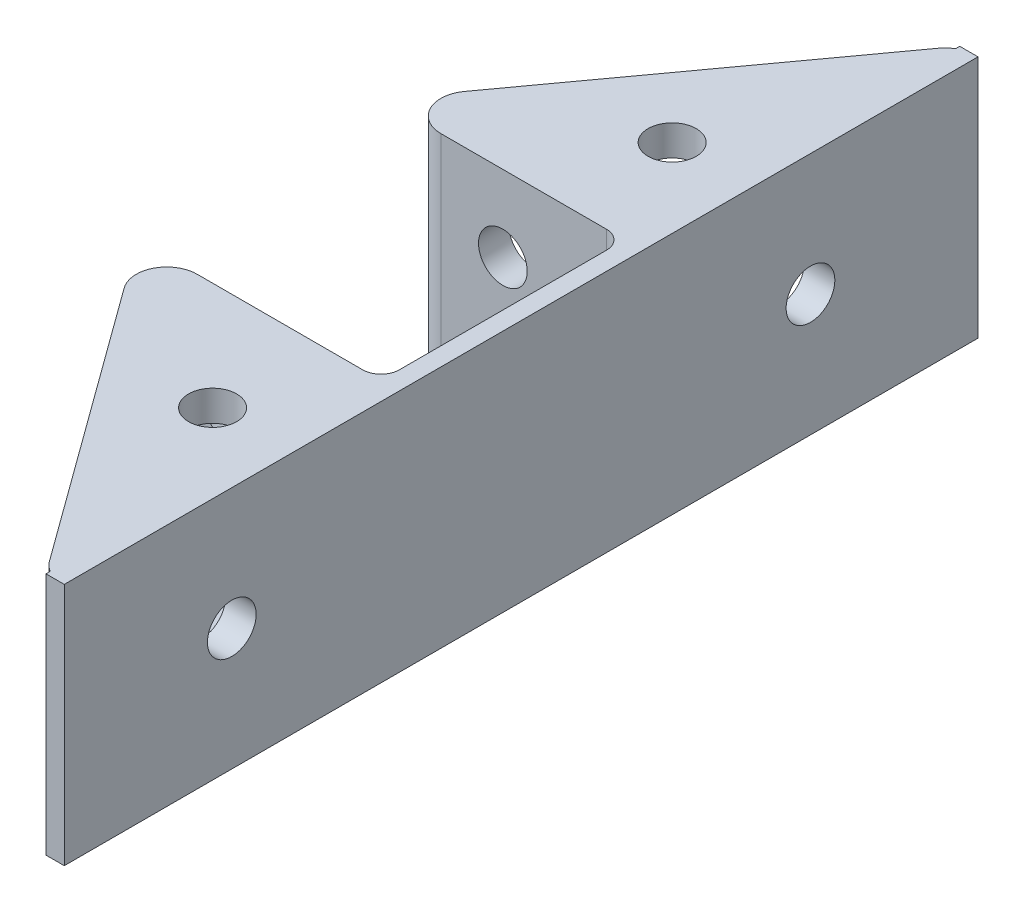
ISO-10303-21;
HEADER;
FILE_DESCRIPTION(('STEP AP214'),'2;1');
FILE_NAME('part.step','',(''),(''),'','','');
FILE_SCHEMA(('AUTOMOTIVE_DESIGN { 1 0 10303 214 1 1 1 1 }'));
ENDSEC;
DATA;
#1=APPLICATION_CONTEXT('core data for automotive mechanical design processes');
#2=APPLICATION_PROTOCOL_DEFINITION('international standard','automotive_design',2000,#1);
#3=PRODUCT_CONTEXT('',#1,'mechanical');
#4=PRODUCT('Part','Part','',(#3));
#5=PRODUCT_RELATED_PRODUCT_CATEGORY('part','',(#4));
#6=PRODUCT_DEFINITION_FORMATION('','',#4);
#7=PRODUCT_DEFINITION_CONTEXT('part definition',#1,'design');
#8=PRODUCT_DEFINITION('design','',#6,#7);
#9=PRODUCT_DEFINITION_SHAPE('','',#8);
#10=(LENGTH_UNIT() NAMED_UNIT(*) SI_UNIT(.MILLI.,.METRE.));
#11=(NAMED_UNIT(*) PLANE_ANGLE_UNIT() SI_UNIT($,.RADIAN.));
#12=(NAMED_UNIT(*) SI_UNIT($,.STERADIAN.) SOLID_ANGLE_UNIT());
#13=UNCERTAINTY_MEASURE_WITH_UNIT(LENGTH_MEASURE(1.E-05),#10,'distance_accuracy_value','');
#14=(GEOMETRIC_REPRESENTATION_CONTEXT(3) GLOBAL_UNCERTAINTY_ASSIGNED_CONTEXT((#13)) GLOBAL_UNIT_ASSIGNED_CONTEXT((#10,
#11,#12)) REPRESENTATION_CONTEXT('',''));
#15=CARTESIAN_POINT('',(0.,0.,0.));
#16=DIRECTION('',(0.,0.,1.));
#17=DIRECTION('',(1.,0.,0.));
#18=AXIS2_PLACEMENT_3D('',#15,#16,#17);
#19=CARTESIAN_POINT('',(20.,250.,0.));
#20=DIRECTION('',(-1.,0.,0.));
#21=DIRECTION('',(0.,0.,1.));
#22=AXIS2_PLACEMENT_3D('',#19,#20,#21);
#23=PLANE('',#22);
#24=DIRECTION('',(0.,0.,1.));
#25=VECTOR('',#24,1.);
#26=CARTESIAN_POINT('',(20.,0.,-95.));
#27=LINE('',#26,#25);
#28=CARTESIAN_POINT('',(20.,0.,-37.));
#29=VERTEX_POINT('',#28);
#30=CARTESIAN_POINT('',(20.,0.,-3.));
#31=VERTEX_POINT('',#30);
#32=EDGE_CURVE('E382',#29,#31,#27,.T.);
#33=ORIENTED_EDGE('',*,*,#32,.T.);
#34=DIRECTION('',(0.,-1.,0.));
#35=VECTOR('',#34,1.);
#36=CARTESIAN_POINT('',(20.,40.,-3.));
#37=LINE('',#36,#35);
#38=CARTESIAN_POINT('',(20.,40.,-3.));
#39=VERTEX_POINT('',#38);
#40=EDGE_CURVE('E426',#31,#39,#37,.F.);
#41=ORIENTED_EDGE('',*,*,#40,.T.);
#42=DIRECTION('',(0.,0.,-1.));
#43=VECTOR('',#42,1.);
#44=CARTESIAN_POINT('',(20.,40.,-95.));
#45=LINE('',#44,#43);
#46=CARTESIAN_POINT('',(20.,40.,-37.));
#47=VERTEX_POINT('',#46);
#48=EDGE_CURVE('E386',#39,#47,#45,.T.);
#49=ORIENTED_EDGE('',*,*,#48,.T.);
#50=DIRECTION('',(0.,-1.,0.));
#51=VECTOR('',#50,1.);
#52=CARTESIAN_POINT('',(20.,0.,-37.));
#53=LINE('',#52,#51);
#54=EDGE_CURVE('E423',#47,#29,#53,.T.);
#55=ORIENTED_EDGE('',*,*,#54,.T.);
#56=EDGE_LOOP('',(#33,#41,#49,#55));
#57=FACE_BOUND('',#56,.T.);
#58=ADVANCED_FACE('F35',(#57),#23,.T.);
#59=CARTESIAN_POINT('',(-20.,108.007352543677,5.));
#60=DIRECTION('',(0.,0.,-1.));
#61=DIRECTION('',(-1.,0.,0.));
#62=AXIS2_PLACEMENT_3D('',#59,#60,#61);
#63=PLANE('',#62);
#64=CARTESIAN_POINT('',(0.,27.5,5.));
#65=DIRECTION('',(0.,0.,1.));
#66=DIRECTION('',(1.,0.,0.));
#67=AXIS2_PLACEMENT_3D('',#64,#65,#66);
#68=CIRCLE('',#67,3.99999999999999);
#69=CARTESIAN_POINT('',(3.99999999999999,27.5,5.));
#70=VERTEX_POINT('',#69);
#71=EDGE_CURVE('E315',#70,#70,#68,.T.);
#72=ORIENTED_EDGE('',*,*,#71,.F.);
#73=EDGE_LOOP('',(#72));
#74=FACE_BOUND('',#73,.T.);
#75=DIRECTION('',(1.,0.,0.));
#76=VECTOR('',#75,1.);
#77=CARTESIAN_POINT('',(-135.2417469626,35.,5.));
#78=LINE('',#77,#76);
#79=CARTESIAN_POINT('',(-15.1811497687566,35.,5.));
#80=VERTEX_POINT('',#79);
#81=CARTESIAN_POINT('',(18.,35.,5.));
#82=VERTEX_POINT('',#81);
#83=EDGE_CURVE('E325',#80,#82,#78,.T.);
#84=ORIENTED_EDGE('',*,*,#83,.F.);
#85=DIRECTION('',(0.,-1.,0.));
#86=VECTOR('',#85,1.);
#87=CARTESIAN_POINT('',(-15.1811497687566,35.,5.));
#88=LINE('',#87,#86);
#89=CARTESIAN_POINT('',(-15.1811497687566,4.99999999999999,5.));
#90=VERTEX_POINT('',#89);
#91=EDGE_CURVE('E411',#80,#90,#88,.T.);
#92=ORIENTED_EDGE('',*,*,#91,.T.);
#93=DIRECTION('',(1.,0.,0.));
#94=VECTOR('',#93,1.);
#95=CARTESIAN_POINT('',(-20.,4.99999999999999,5.));
#96=LINE('',#95,#94);
#97=CARTESIAN_POINT('',(18.,4.99999999999999,5.));
#98=VERTEX_POINT('',#97);
#99=EDGE_CURVE('E329',#90,#98,#96,.T.);
#100=ORIENTED_EDGE('',*,*,#99,.T.);
#101=DIRECTION('',(0.,-1.,0.));
#102=VECTOR('',#101,1.);
#103=CARTESIAN_POINT('',(18.,108.007352543677,5.));
#104=LINE('',#103,#102);
#105=EDGE_CURVE('E345',#82,#98,#104,.T.);
#106=ORIENTED_EDGE('',*,*,#105,.F.);
#107=EDGE_LOOP('',(#84,#92,#100,#106));
#108=FACE_BOUND('',#107,.T.);
#109=CARTESIAN_POINT('',(0.,12.5,5.));
#110=DIRECTION('',(0.,0.,1.));
#111=DIRECTION('',(1.,0.,0.));
#112=AXIS2_PLACEMENT_3D('',#109,#110,#111);
#113=CIRCLE('',#112,3.99999999999999);
#114=CARTESIAN_POINT('',(3.99999999999999,12.5,5.));
#115=VERTEX_POINT('',#114);
#116=EDGE_CURVE('E309',#115,#115,#113,.T.);
#117=ORIENTED_EDGE('',*,*,#116,.F.);
#118=EDGE_LOOP('',(#117));
#119=FACE_BOUND('',#118,.T.);
#120=ADVANCED_FACE('F518',(#74,#108,#119),#63,.F.);
#121=CARTESIAN_POINT('',(-135.2417469626,0.,-95.));
#122=DIRECTION('',(0.,0.,1.));
#123=DIRECTION('',(1.,0.,0.));
#124=AXIS2_PLACEMENT_3D('',#121,#122,#123);
#125=PLANE('',#124);
#126=DIRECTION('',(1.,0.,0.));
#127=VECTOR('',#126,1.);
#128=CARTESIAN_POINT('',(-135.2417469626,40.,-95.));
#129=LINE('',#128,#127);
#130=CARTESIAN_POINT('',(20.,40.,-95.));
#131=VERTEX_POINT('',#130);
#132=CARTESIAN_POINT('',(23.,40.,-95.));
#133=VERTEX_POINT('',#132);
#134=EDGE_CURVE('E362',#131,#133,#129,.T.);
#135=ORIENTED_EDGE('',*,*,#134,.T.);
#136=DIRECTION('',(0.,-1.,0.));
#137=VECTOR('',#136,1.);
#138=CARTESIAN_POINT('',(23.,0.,-95.));
#139=LINE('',#138,#137);
#140=CARTESIAN_POINT('',(23.,0.,-95.));
#141=VERTEX_POINT('',#140);
#142=EDGE_CURVE('E376',#133,#141,#139,.T.);
#143=ORIENTED_EDGE('',*,*,#142,.T.);
#144=DIRECTION('',(1.,0.,0.));
#145=VECTOR('',#144,1.);
#146=CARTESIAN_POINT('',(-135.2417469626,0.,-95.));
#147=LINE('',#146,#145);
#148=CARTESIAN_POINT('',(20.,0.,-95.));
#149=VERTEX_POINT('',#148);
#150=EDGE_CURVE('E375',#149,#141,#147,.T.);
#151=ORIENTED_EDGE('',*,*,#150,.F.);
#152=DIRECTION('',(0.,-1.,0.));
#153=VECTOR('',#152,1.);
#154=CARTESIAN_POINT('',(20.,0.,-95.));
#155=LINE('',#154,#153);
#156=EDGE_CURVE('E383',#131,#149,#155,.T.);
#157=ORIENTED_EDGE('',*,*,#156,.F.);
#158=EDGE_LOOP('',(#135,#143,#151,#157));
#159=FACE_BOUND('',#158,.T.);
#160=ADVANCED_FACE('F476',(#159),#125,.F.);
#161=CARTESIAN_POINT('',(-135.2417469626,0.,-95.));
#162=DIRECTION('',(0.,1.,0.));
#163=DIRECTION('',(0.,0.,1.));
#164=AXIS2_PLACEMENT_3D('',#161,#162,#163);
#165=PLANE('',#164);
#166=ORIENTED_EDGE('',*,*,#150,.T.);
#167=DIRECTION('',(0.,0.,1.));
#168=VECTOR('',#167,1.);
#169=CARTESIAN_POINT('',(23.,0.,-95.));
#170=LINE('',#169,#168);
#171=CARTESIAN_POINT('',(23.,0.,55.));
#172=VERTEX_POINT('',#171);
#173=EDGE_CURVE('E372',#141,#172,#170,.T.);
#174=ORIENTED_EDGE('',*,*,#173,.T.);
#175=DIRECTION('',(1.,0.,0.));
#176=VECTOR('',#175,1.);
#177=CARTESIAN_POINT('',(-135.2417469626,0.,55.));
#178=LINE('',#177,#176);
#179=CARTESIAN_POINT('',(20.,0.,55.));
#180=VERTEX_POINT('',#179);
#181=EDGE_CURVE('E371',#180,#172,#178,.T.);
#182=ORIENTED_EDGE('',*,*,#181,.F.);
#183=DIRECTION('',(0.,0.,-1.));
#184=VECTOR('',#183,1.);
#185=CARTESIAN_POINT('',(20.,0.,55.));
#186=LINE('',#185,#184);
#187=CARTESIAN_POINT('',(20.,0.,54.3031683536805));
#188=VERTEX_POINT('',#187);
#189=EDGE_CURVE('E262',#180,#188,#186,.T.);
#190=ORIENTED_EDGE('',*,*,#189,.T.);
#191=CARTESIAN_POINT('',(22.546122958516,0.,50.));
#192=DIRECTION('',(0.,1.,0.));
#193=DIRECTION('',(0.,0.,1.));
#194=AXIS2_PLACEMENT_3D('',#191,#192,#193);
#195=CIRCLE('',#194,5.);
#196=CARTESIAN_POINT('',(18.5024425370001,0.,52.9408584883752));
#197=VERTEX_POINT('',#196);
#198=EDGE_CURVE('E407',#188,#197,#195,.F.);
#199=ORIENTED_EDGE('',*,*,#198,.T.);
#200=DIRECTION('',(-0.588171697675046,0.,-0.808736084303189));
#201=VECTOR('',#200,1.);
#202=CARTESIAN_POINT('',(19.9999999999999,0.,55.));
#203=LINE('',#202,#201);
#204=CARTESIAN_POINT('',(-14.2248301902726,0.,7.94085848837522));
#205=VERTEX_POINT('',#204);
#206=EDGE_CURVE('E350',#197,#205,#203,.T.);
#207=ORIENTED_EDGE('',*,*,#206,.T.);
#208=CARTESIAN_POINT('',(-10.1811497687566,0.,5.));
#209=DIRECTION('',(0.,1.,0.));
#210=DIRECTION('',(0.,0.,1.));
#211=AXIS2_PLACEMENT_3D('',#208,#209,#210);
#212=CIRCLE('',#211,5.);
#213=CARTESIAN_POINT('',(-10.1811497687566,0.,0.));
#214=VERTEX_POINT('',#213);
#215=EDGE_CURVE('E405',#205,#214,#212,.F.);
#216=ORIENTED_EDGE('',*,*,#215,.T.);
#217=DIRECTION('',(1.,0.,0.));
#218=VECTOR('',#217,1.);
#219=CARTESIAN_POINT('',(-20.,0.,0.));
#220=LINE('',#219,#218);
#221=CARTESIAN_POINT('',(17.,0.,0.));
#222=VERTEX_POINT('',#221);
#223=EDGE_CURVE('E351',#214,#222,#220,.T.);
#224=ORIENTED_EDGE('',*,*,#223,.T.);
#225=CARTESIAN_POINT('',(17.,0.,-3.));
#226=DIRECTION('',(0.,1.,0.));
#227=DIRECTION('',(0.,0.,1.));
#228=AXIS2_PLACEMENT_3D('',#225,#226,#227);
#229=CIRCLE('',#228,3.);
#230=EDGE_CURVE('E429',#222,#31,#229,.T.);
#231=ORIENTED_EDGE('',*,*,#230,.T.);
#232=ORIENTED_EDGE('',*,*,#32,.F.);
#233=CARTESIAN_POINT('',(17.,0.,-37.));
#234=DIRECTION('',(0.,1.,0.));
#235=DIRECTION('',(0.,0.,1.));
#236=AXIS2_PLACEMENT_3D('',#233,#234,#235);
#237=CIRCLE('',#236,3.);
#238=CARTESIAN_POINT('',(17.,0.,-40.));
#239=VERTEX_POINT('',#238);
#240=EDGE_CURVE('E43',#29,#239,#237,.T.);
#241=ORIENTED_EDGE('',*,*,#240,.T.);
#242=DIRECTION('',(1.,0.,0.));
#243=VECTOR('',#242,1.);
#244=CARTESIAN_POINT('',(-20.,0.,-40.));
#245=LINE('',#244,#243);
#246=CARTESIAN_POINT('',(-10.1811497687566,0.,-40.));
#247=VERTEX_POINT('',#246);
#248=EDGE_CURVE('E252',#247,#239,#245,.T.);
#249=ORIENTED_EDGE('',*,*,#248,.F.);
#250=CARTESIAN_POINT('',(-10.1811497687566,0.,-45.));
#251=DIRECTION('',(0.,-1.,0.));
#252=DIRECTION('',(0.,0.,-1.));
#253=AXIS2_PLACEMENT_3D('',#250,#251,#252);
#254=CIRCLE('',#253,5.);
#255=CARTESIAN_POINT('',(-14.2248301902726,0.,-47.9408584883752));
#256=VERTEX_POINT('',#255);
#257=EDGE_CURVE('E283',#256,#247,#254,.F.);
#258=ORIENTED_EDGE('',*,*,#257,.F.);
#259=DIRECTION('',(-0.588171697675046,0.,0.808736084303189));
#260=VECTOR('',#259,1.);
#261=CARTESIAN_POINT('',(19.9999999999999,0.,-95.));
#262=LINE('',#261,#260);
#263=CARTESIAN_POINT('',(18.5024425370001,0.,-92.9408584883752));
#264=VERTEX_POINT('',#263);
#265=EDGE_CURVE('E251',#264,#256,#262,.T.);
#266=ORIENTED_EDGE('',*,*,#265,.F.);
#267=CARTESIAN_POINT('',(22.546122958516,0.,-90.));
#268=DIRECTION('',(0.,-1.,0.));
#269=DIRECTION('',(0.,0.,-1.));
#270=AXIS2_PLACEMENT_3D('',#267,#268,#269);
#271=CIRCLE('',#270,5.);
#272=CARTESIAN_POINT('',(20.,0.,-94.3031683536805));
#273=VERTEX_POINT('',#272);
#274=EDGE_CURVE('E286',#273,#264,#271,.F.);
#275=ORIENTED_EDGE('',*,*,#274,.F.);
#276=EDGE_CURVE('E379',#149,#273,#27,.T.);
#277=ORIENTED_EDGE('',*,*,#276,.F.);
#278=EDGE_LOOP('',(#166,#174,#182,#190,#199,#207,#216,#224,#231,#232,#241,#249,#258,#266,#275,#277));
#279=FACE_BOUND('',#278,.T.);
#280=ADVANCED_FACE('F449',(#279),#165,.F.);
#281=CARTESIAN_POINT('',(-135.2417469626,0.,55.));
#282=DIRECTION('',(0.,0.,-1.));
#283=DIRECTION('',(-1.,0.,0.));
#284=AXIS2_PLACEMENT_3D('',#281,#282,#283);
#285=PLANE('',#284);
#286=DIRECTION('',(1.,0.,0.));
#287=VECTOR('',#286,1.);
#288=CARTESIAN_POINT('',(-135.2417469626,40.,55.));
#289=LINE('',#288,#287);
#290=CARTESIAN_POINT('',(20.,40.,55.));
#291=VERTEX_POINT('',#290);
#292=CARTESIAN_POINT('',(23.,40.,55.));
#293=VERTEX_POINT('',#292);
#294=EDGE_CURVE('E367',#291,#293,#289,.T.);
#295=ORIENTED_EDGE('',*,*,#294,.F.);
#296=DIRECTION('',(0.,-1.,0.));
#297=VECTOR('',#296,1.);
#298=CARTESIAN_POINT('',(20.,0.,55.));
#299=LINE('',#298,#297);
#300=EDGE_CURVE('E266',#291,#180,#299,.T.);
#301=ORIENTED_EDGE('',*,*,#300,.T.);
#302=ORIENTED_EDGE('',*,*,#181,.T.);
#303=DIRECTION('',(0.,1.,0.));
#304=VECTOR('',#303,1.);
#305=CARTESIAN_POINT('',(23.,0.,55.));
#306=LINE('',#305,#304);
#307=EDGE_CURVE('E368',#172,#293,#306,.T.);
#308=ORIENTED_EDGE('',*,*,#307,.T.);
#309=EDGE_LOOP('',(#295,#301,#302,#308));
#310=FACE_BOUND('',#309,.T.);
#311=ADVANCED_FACE('F488',(#310),#285,.F.);
#312=CARTESIAN_POINT('',(-135.2417469626,40.,-95.));
#313=DIRECTION('',(0.,-1.,0.));
#314=DIRECTION('',(0.,0.,-1.));
#315=AXIS2_PLACEMENT_3D('',#312,#313,#314);
#316=PLANE('',#315);
#317=CARTESIAN_POINT('',(20.,40.,-94.3031683536805));
#318=VERTEX_POINT('',#317);
#319=EDGE_CURVE('E366',#318,#131,#45,.T.);
#320=ORIENTED_EDGE('',*,*,#319,.F.);
#321=CARTESIAN_POINT('',(22.546122958516,40.,-90.));
#322=DIRECTION('',(0.,1.,0.));
#323=DIRECTION('',(0.,0.,1.));
#324=AXIS2_PLACEMENT_3D('',#321,#322,#323);
#325=CIRCLE('',#324,5.);
#326=CARTESIAN_POINT('',(18.5024425370001,40.,-92.9408584883752));
#327=VERTEX_POINT('',#326);
#328=EDGE_CURVE('E280',#327,#318,#325,.F.);
#329=ORIENTED_EDGE('',*,*,#328,.F.);
#330=DIRECTION('',(-0.588171697675046,0.,0.808736084303189));
#331=VECTOR('',#330,1.);
#332=CARTESIAN_POINT('',(19.9999999999999,40.,-95.));
#333=LINE('',#332,#331);
#334=CARTESIAN_POINT('',(-14.2248301902726,40.,-47.9408584883752));
#335=VERTEX_POINT('',#334);
#336=EDGE_CURVE('E254',#327,#335,#333,.T.);
#337=ORIENTED_EDGE('',*,*,#336,.T.);
#338=CARTESIAN_POINT('',(-10.1811497687566,40.,-45.));
#339=DIRECTION('',(0.,1.,0.));
#340=DIRECTION('',(0.,0.,1.));
#341=AXIS2_PLACEMENT_3D('',#338,#339,#340);
#342=CIRCLE('',#341,5.);
#343=CARTESIAN_POINT('',(-10.1811497687566,40.,-40.));
#344=VERTEX_POINT('',#343);
#345=EDGE_CURVE('E277',#344,#335,#342,.F.);
#346=ORIENTED_EDGE('',*,*,#345,.F.);
#347=DIRECTION('',(1.,0.,0.));
#348=VECTOR('',#347,1.);
#349=CARTESIAN_POINT('',(-20.,40.,-40.));
#350=LINE('',#349,#348);
#351=CARTESIAN_POINT('',(17.,40.,-40.));
#352=VERTEX_POINT('',#351);
#353=EDGE_CURVE('E259',#344,#352,#350,.T.);
#354=ORIENTED_EDGE('',*,*,#353,.T.);
#355=CARTESIAN_POINT('',(17.,40.,-37.));
#356=DIRECTION('',(0.,-1.,0.));
#357=DIRECTION('',(0.,0.,-1.));
#358=AXIS2_PLACEMENT_3D('',#355,#356,#357);
#359=CIRCLE('',#358,3.);
#360=EDGE_CURVE('E11',#352,#47,#359,.T.);
#361=ORIENTED_EDGE('',*,*,#360,.T.);
#362=ORIENTED_EDGE('',*,*,#48,.F.);
#363=CARTESIAN_POINT('',(17.,40.,-3.));
#364=DIRECTION('',(0.,-1.,0.));
#365=DIRECTION('',(0.,0.,-1.));
#366=AXIS2_PLACEMENT_3D('',#363,#364,#365);
#367=CIRCLE('',#366,3.);
#368=CARTESIAN_POINT('',(17.,40.,0.));
#369=VERTEX_POINT('',#368);
#370=EDGE_CURVE('E431',#39,#369,#367,.T.);
#371=ORIENTED_EDGE('',*,*,#370,.T.);
#372=DIRECTION('',(1.,0.,0.));
#373=VECTOR('',#372,1.);
#374=CARTESIAN_POINT('',(-20.,40.,0.));
#375=LINE('',#374,#373);
#376=CARTESIAN_POINT('',(-10.1811497687566,40.,0.));
#377=VERTEX_POINT('',#376);
#378=EDGE_CURVE('E359',#377,#369,#375,.T.);
#379=ORIENTED_EDGE('',*,*,#378,.F.);
#380=CARTESIAN_POINT('',(-10.1811497687566,40.,5.));
#381=DIRECTION('',(0.,-1.,0.));
#382=DIRECTION('',(0.,0.,-1.));
#383=AXIS2_PLACEMENT_3D('',#380,#381,#382);
#384=CIRCLE('',#383,5.);
#385=CARTESIAN_POINT('',(-14.2248301902726,40.,7.94085848837521));
#386=VERTEX_POINT('',#385);
#387=EDGE_CURVE('E400',#377,#386,#384,.F.);
#388=ORIENTED_EDGE('',*,*,#387,.T.);
#389=DIRECTION('',(-0.588171697675046,0.,-0.808736084303189));
#390=VECTOR('',#389,1.);
#391=CARTESIAN_POINT('',(19.9999999999999,40.,55.));
#392=LINE('',#391,#390);
#393=CARTESIAN_POINT('',(18.5024425370001,40.,52.9408584883752));
#394=VERTEX_POINT('',#393);
#395=EDGE_CURVE('E354',#394,#386,#392,.T.);
#396=ORIENTED_EDGE('',*,*,#395,.F.);
#397=CARTESIAN_POINT('',(22.546122958516,40.,50.));
#398=DIRECTION('',(0.,-1.,0.));
#399=DIRECTION('',(0.,0.,-1.));
#400=AXIS2_PLACEMENT_3D('',#397,#398,#399);
#401=CIRCLE('',#400,5.);
#402=CARTESIAN_POINT('',(20.,40.,54.3031683536805));
#403=VERTEX_POINT('',#402);
#404=EDGE_CURVE('E402',#394,#403,#401,.F.);
#405=ORIENTED_EDGE('',*,*,#404,.T.);
#406=DIRECTION('',(0.,0.,1.));
#407=VECTOR('',#406,1.);
#408=CARTESIAN_POINT('',(20.,40.,55.));
#409=LINE('',#408,#407);
#410=EDGE_CURVE('E261',#403,#291,#409,.T.);
#411=ORIENTED_EDGE('',*,*,#410,.T.);
#412=ORIENTED_EDGE('',*,*,#294,.T.);
#413=DIRECTION('',(0.,0.,-1.));
#414=VECTOR('',#413,1.);
#415=CARTESIAN_POINT('',(23.,40.,-95.));
#416=LINE('',#415,#414);
#417=EDGE_CURVE('E363',#293,#133,#416,.T.);
#418=ORIENTED_EDGE('',*,*,#417,.T.);
#419=ORIENTED_EDGE('',*,*,#134,.F.);
#420=EDGE_LOOP('',(#320,#329,#337,#346,#354,#361,#362,#371,#379,#388,#396,#405,#411,#412,#418,#419));
#421=FACE_BOUND('',#420,.T.);
#422=CARTESIAN_POINT('',(10.0694030866819,40.,-57.7204292441876));
#423=DIRECTION('',(0.,1.,0.));
#424=DIRECTION('',(0.,0.,1.));
#425=AXIS2_PLACEMENT_3D('',#422,#423,#424);
#426=CIRCLE('',#425,3.95);
#427=CARTESIAN_POINT('',(10.0694030866819,40.,-53.7704292441876));
#428=VERTEX_POINT('',#427);
#429=EDGE_CURVE('E895',#428,#428,#426,.F.);
#430=ORIENTED_EDGE('',*,*,#429,.T.);
#431=EDGE_LOOP('',(#430));
#432=FACE_BOUND('',#431,.T.);
#433=CARTESIAN_POINT('',(10.0694030866819,40.,17.7204292441876));
#434=DIRECTION('',(0.,-1.,0.));
#435=DIRECTION('',(0.,0.,-1.));
#436=AXIS2_PLACEMENT_3D('',#433,#434,#435);
#437=CIRCLE('',#436,3.95);
#438=CARTESIAN_POINT('',(10.0694030866819,40.,13.7704292441876));
#439=VERTEX_POINT('',#438);
#440=EDGE_CURVE('E303',#439,#439,#437,.F.);
#441=ORIENTED_EDGE('',*,*,#440,.F.);
#442=EDGE_LOOP('',(#441));
#443=FACE_BOUND('',#442,.T.);
#444=ADVANCED_FACE('F437',(#421,#432,#443),#316,.F.);
#445=CARTESIAN_POINT('',(23.,0.,0.));
#446=DIRECTION('',(1.,0.,0.));
#447=DIRECTION('',(0.,0.,-1.));
#448=AXIS2_PLACEMENT_3D('',#445,#446,#447);
#449=PLANE('',#448);
#450=CARTESIAN_POINT('',(23.,20.,27.5));
#451=DIRECTION('',(1.,0.,0.));
#452=DIRECTION('',(0.,0.,-1.));
#453=AXIS2_PLACEMENT_3D('',#450,#451,#452);
#454=CIRCLE('',#453,4.);
#455=CARTESIAN_POINT('',(23.,20.,23.5));
#456=VERTEX_POINT('',#455);
#457=EDGE_CURVE('E901',#456,#456,#454,.F.);
#458=ORIENTED_EDGE('',*,*,#457,.T.);
#459=EDGE_LOOP('',(#458));
#460=FACE_BOUND('',#459,.T.);
#461=CARTESIAN_POINT('',(23.,20.,-67.5));
#462=DIRECTION('',(1.,0.,0.));
#463=DIRECTION('',(0.,0.,-1.));
#464=AXIS2_PLACEMENT_3D('',#461,#462,#463);
#465=CIRCLE('',#464,3.99999999999999);
#466=CARTESIAN_POINT('',(23.,20.,-71.5));
#467=VERTEX_POINT('',#466);
#468=EDGE_CURVE('E902',#467,#467,#465,.F.);
#469=ORIENTED_EDGE('',*,*,#468,.T.);
#470=EDGE_LOOP('',(#469));
#471=FACE_BOUND('',#470,.T.);
#472=ORIENTED_EDGE('',*,*,#142,.F.);
#473=ORIENTED_EDGE('',*,*,#417,.F.);
#474=ORIENTED_EDGE('',*,*,#307,.F.);
#475=ORIENTED_EDGE('',*,*,#173,.F.);
#476=EDGE_LOOP('',(#472,#473,#474,#475));
#477=FACE_BOUND('',#476,.T.);
#478=ADVANCED_FACE('F480',(#460,#471,#477),#449,.T.);
#479=DIRECTION('',(0.,-1.,0.));
#480=VECTOR('',#479,1.);
#481=CARTESIAN_POINT('',(20.,108.007352543677,-94.3031683536805));
#482=LINE('',#481,#480);
#483=EDGE_CURVE('E417',#318,#273,#482,.T.);
#484=ORIENTED_EDGE('',*,*,#483,.F.);
#485=ORIENTED_EDGE('',*,*,#319,.T.);
#486=ORIENTED_EDGE('',*,*,#156,.T.);
#487=ORIENTED_EDGE('',*,*,#276,.T.);
#488=EDGE_LOOP('',(#484,#485,#486,#487));
#489=FACE_BOUND('',#488,.T.);
#490=ADVANCED_FACE('F472',(#489),#23,.T.);
#491=CARTESIAN_POINT('',(19.9999999999999,108.007352543677,55.));
#492=DIRECTION('',(-0.808736084303189,0.,0.588171697675046));
#493=DIRECTION('',(0.588171697675046,0.,0.808736084303189));
#494=AXIS2_PLACEMENT_3D('',#491,#492,#493);
#495=PLANE('',#494);
#496=ORIENTED_EDGE('',*,*,#206,.F.);
#497=DIRECTION('',(0.,1.,0.));
#498=VECTOR('',#497,1.);
#499=CARTESIAN_POINT('',(18.5024425370001,40.,52.9408584883752));
#500=LINE('',#499,#498);
#501=EDGE_CURVE('E397',#197,#394,#500,.T.);
#502=ORIENTED_EDGE('',*,*,#501,.T.);
#503=ORIENTED_EDGE('',*,*,#395,.T.);
#504=DIRECTION('',(0.,-1.,0.));
#505=VECTOR('',#504,1.);
#506=CARTESIAN_POINT('',(-14.2248301902726,108.007352543677,7.94085848837522));
#507=LINE('',#506,#505);
#508=CARTESIAN_POINT('',(-14.2248301902725,35.,7.94085848837525));
#509=VERTEX_POINT('',#508);
#510=EDGE_CURVE('E394',#386,#509,#507,.T.);
#511=ORIENTED_EDGE('',*,*,#510,.T.);
#512=DIRECTION('',(-0.588171697675046,0.,-0.808736084303189));
#513=VECTOR('',#512,1.);
#514=CARTESIAN_POINT('',(-105.056604354629,35.,-116.952830987615));
#515=LINE('',#514,#513);
#516=CARTESIAN_POINT('',(16.3636363636363,35.,50.));
#517=VERTEX_POINT('',#516);
#518=EDGE_CURVE('E331',#517,#509,#515,.T.);
#519=ORIENTED_EDGE('',*,*,#518,.F.);
#520=DIRECTION('',(0.,1.,0.));
#521=VECTOR('',#520,1.);
#522=CARTESIAN_POINT('',(16.3636363636363,0.,50.));
#523=LINE('',#522,#521);
#524=CARTESIAN_POINT('',(16.3636363636363,4.99999999999999,50.));
#525=VERTEX_POINT('',#524);
#526=EDGE_CURVE('E340',#525,#517,#523,.T.);
#527=ORIENTED_EDGE('',*,*,#526,.F.);
#528=DIRECTION('',(-0.588171697675046,0.,-0.808736084303189));
#529=VECTOR('',#528,1.);
#530=CARTESIAN_POINT('',(19.9999999999999,4.99999999999999,55.));
#531=LINE('',#530,#529);
#532=CARTESIAN_POINT('',(-14.2248301902726,4.99999999999999,7.94085848837521));
#533=VERTEX_POINT('',#532);
#534=EDGE_CURVE('E321',#525,#533,#531,.T.);
#535=ORIENTED_EDGE('',*,*,#534,.T.);
#536=DIRECTION('',(0.,-1.,0.));
#537=VECTOR('',#536,1.);
#538=CARTESIAN_POINT('',(-14.2248301902726,108.007352543677,7.94085848837522));
#539=LINE('',#538,#537);
#540=EDGE_CURVE('E381',#533,#205,#539,.T.);
#541=ORIENTED_EDGE('',*,*,#540,.T.);
#542=EDGE_LOOP('',(#496,#502,#503,#511,#519,#527,#535,#541));
#543=FACE_BOUND('',#542,.T.);
#544=ADVANCED_FACE('F495',(#543),#495,.T.);
#545=CARTESIAN_POINT('',(-20.,108.007352543677,0.));
#546=DIRECTION('',(0.,0.,-1.));
#547=DIRECTION('',(-1.,0.,0.));
#548=AXIS2_PLACEMENT_3D('',#545,#546,#547);
#549=PLANE('',#548);
#550=CARTESIAN_POINT('',(0.,12.5,0.));
#551=DIRECTION('',(0.,0.,-1.));
#552=DIRECTION('',(-1.,0.,0.));
#553=AXIS2_PLACEMENT_3D('',#550,#551,#552);
#554=CIRCLE('',#553,3.99999999999999);
#555=CARTESIAN_POINT('',(-3.99999999999999,12.5,0.));
#556=VERTEX_POINT('',#555);
#557=EDGE_CURVE('E312',#556,#556,#554,.T.);
#558=ORIENTED_EDGE('',*,*,#557,.F.);
#559=EDGE_LOOP('',(#558));
#560=FACE_BOUND('',#559,.T.);
#561=CARTESIAN_POINT('',(0.,27.5,0.));
#562=DIRECTION('',(0.,0.,-1.));
#563=DIRECTION('',(-1.,0.,0.));
#564=AXIS2_PLACEMENT_3D('',#561,#562,#563);
#565=CIRCLE('',#564,3.99999999999999);
#566=CARTESIAN_POINT('',(-3.99999999999999,27.5,0.));
#567=VERTEX_POINT('',#566);
#568=EDGE_CURVE('E318',#567,#567,#565,.T.);
#569=ORIENTED_EDGE('',*,*,#568,.F.);
#570=EDGE_LOOP('',(#569));
#571=FACE_BOUND('',#570,.T.);
#572=ORIENTED_EDGE('',*,*,#378,.T.);
#573=DIRECTION('',(0.,-1.,0.));
#574=VECTOR('',#573,1.);
#575=CARTESIAN_POINT('',(17.,0.,0.));
#576=LINE('',#575,#574);
#577=EDGE_CURVE('E420',#369,#222,#576,.T.);
#578=ORIENTED_EDGE('',*,*,#577,.T.);
#579=ORIENTED_EDGE('',*,*,#223,.F.);
#580=DIRECTION('',(0.,-1.,0.));
#581=VECTOR('',#580,1.);
#582=CARTESIAN_POINT('',(-10.1811497687566,108.007352543677,0.));
#583=LINE('',#582,#581);
#584=EDGE_CURVE('E415',#214,#377,#583,.F.);
#585=ORIENTED_EDGE('',*,*,#584,.T.);
#586=EDGE_LOOP('',(#572,#578,#579,#585));
#587=FACE_BOUND('',#586,.T.);
#588=ADVANCED_FACE('F444',(#560,#571,#587),#549,.T.);
#589=CARTESIAN_POINT('',(-135.2417469626,4.99999999999999,-95.));
#590=DIRECTION('',(0.,1.,0.));
#591=DIRECTION('',(0.,0.,1.));
#592=AXIS2_PLACEMENT_3D('',#589,#590,#591);
#593=PLANE('',#592);
#594=ORIENTED_EDGE('',*,*,#99,.F.);
#595=CARTESIAN_POINT('',(-10.1811497687566,4.99999999999999,5.));
#596=DIRECTION('',(0.,1.,0.));
#597=DIRECTION('',(0.,0.,1.));
#598=AXIS2_PLACEMENT_3D('',#595,#596,#597);
#599=CIRCLE('',#598,5.);
#600=EDGE_CURVE('E413',#90,#533,#599,.T.);
#601=ORIENTED_EDGE('',*,*,#600,.T.);
#602=ORIENTED_EDGE('',*,*,#534,.F.);
#603=DIRECTION('',(1.,0.,0.));
#604=VECTOR('',#603,1.);
#605=CARTESIAN_POINT('',(-135.2417469626,4.99999999999999,50.));
#606=LINE('',#605,#604);
#607=CARTESIAN_POINT('',(18.,4.99999999999999,50.));
#608=VERTEX_POINT('',#607);
#609=EDGE_CURVE('E324',#525,#608,#606,.T.);
#610=ORIENTED_EDGE('',*,*,#609,.T.);
#611=DIRECTION('',(0.,0.,1.));
#612=VECTOR('',#611,1.);
#613=CARTESIAN_POINT('',(18.,4.99999999999999,0.));
#614=LINE('',#613,#612);
#615=EDGE_CURVE('E322',#98,#608,#614,.T.);
#616=ORIENTED_EDGE('',*,*,#615,.F.);
#617=EDGE_LOOP('',(#594,#601,#602,#610,#616));
#618=FACE_BOUND('',#617,.T.);
#619=ADVANCED_FACE('F515',(#618),#593,.T.);
#620=CARTESIAN_POINT('',(-135.2417469626,0.,50.));
#621=DIRECTION('',(0.,0.,-1.));
#622=DIRECTION('',(-1.,0.,0.));
#623=AXIS2_PLACEMENT_3D('',#620,#621,#622);
#624=PLANE('',#623);
#625=ORIENTED_EDGE('',*,*,#526,.T.);
#626=DIRECTION('',(1.,0.,0.));
#627=VECTOR('',#626,1.);
#628=CARTESIAN_POINT('',(-135.2417469626,35.,50.));
#629=LINE('',#628,#627);
#630=CARTESIAN_POINT('',(18.,35.,50.));
#631=VERTEX_POINT('',#630);
#632=EDGE_CURVE('E334',#517,#631,#629,.T.);
#633=ORIENTED_EDGE('',*,*,#632,.T.);
#634=DIRECTION('',(0.,1.,0.));
#635=VECTOR('',#634,1.);
#636=CARTESIAN_POINT('',(18.,0.,50.));
#637=LINE('',#636,#635);
#638=EDGE_CURVE('E328',#608,#631,#637,.T.);
#639=ORIENTED_EDGE('',*,*,#638,.F.);
#640=ORIENTED_EDGE('',*,*,#609,.F.);
#641=EDGE_LOOP('',(#625,#633,#639,#640));
#642=FACE_BOUND('',#641,.T.);
#643=ADVANCED_FACE('F511',(#642),#624,.T.);
#644=CARTESIAN_POINT('',(-135.2417469626,35.,-95.));
#645=DIRECTION('',(0.,-1.,0.));
#646=DIRECTION('',(0.,0.,-1.));
#647=AXIS2_PLACEMENT_3D('',#644,#645,#646);
#648=PLANE('',#647);
#649=CARTESIAN_POINT('',(10.0694030866819,35.,17.7204292441876));
#650=DIRECTION('',(0.,-1.,0.));
#651=DIRECTION('',(0.,0.,-1.));
#652=AXIS2_PLACEMENT_3D('',#649,#650,#651);
#653=CIRCLE('',#652,3.95);
#654=CARTESIAN_POINT('',(10.0694030866819,35.,13.7704292441876));
#655=VERTEX_POINT('',#654);
#656=EDGE_CURVE('E300',#655,#655,#653,.T.);
#657=ORIENTED_EDGE('',*,*,#656,.F.);
#658=EDGE_LOOP('',(#657));
#659=FACE_BOUND('',#658,.T.);
#660=ORIENTED_EDGE('',*,*,#518,.T.);
#661=CARTESIAN_POINT('',(-10.1811497687566,35.,5.));
#662=DIRECTION('',(0.,-1.,0.));
#663=DIRECTION('',(0.,0.,-1.));
#664=AXIS2_PLACEMENT_3D('',#661,#662,#663);
#665=CIRCLE('',#664,5.);
#666=EDGE_CURVE('E409',#509,#80,#665,.T.);
#667=ORIENTED_EDGE('',*,*,#666,.T.);
#668=ORIENTED_EDGE('',*,*,#83,.T.);
#669=DIRECTION('',(0.,0.,-1.));
#670=VECTOR('',#669,1.);
#671=CARTESIAN_POINT('',(18.,35.,0.));
#672=LINE('',#671,#670);
#673=EDGE_CURVE('E336',#631,#82,#672,.T.);
#674=ORIENTED_EDGE('',*,*,#673,.F.);
#675=ORIENTED_EDGE('',*,*,#632,.F.);
#676=EDGE_LOOP('',(#660,#667,#668,#674,#675));
#677=FACE_BOUND('',#676,.T.);
#678=ADVANCED_FACE('F506',(#659,#677),#648,.T.);
#679=CARTESIAN_POINT('',(18.,0.,0.));
#680=DIRECTION('',(1.,0.,0.));
#681=DIRECTION('',(0.,0.,-1.));
#682=AXIS2_PLACEMENT_3D('',#679,#680,#681);
#683=PLANE('',#682);
#684=CARTESIAN_POINT('',(18.,20.,27.5));
#685=DIRECTION('',(-1.,0.,0.));
#686=DIRECTION('',(0.,0.,1.));
#687=AXIS2_PLACEMENT_3D('',#684,#685,#686);
#688=CIRCLE('',#687,3.99999999999999);
#689=CARTESIAN_POINT('',(18.,20.,31.5));
#690=VERTEX_POINT('',#689);
#691=EDGE_CURVE('E306',#690,#690,#688,.T.);
#692=ORIENTED_EDGE('',*,*,#691,.F.);
#693=EDGE_LOOP('',(#692));
#694=FACE_BOUND('',#693,.T.);
#695=ORIENTED_EDGE('',*,*,#105,.T.);
#696=ORIENTED_EDGE('',*,*,#615,.T.);
#697=ORIENTED_EDGE('',*,*,#638,.T.);
#698=ORIENTED_EDGE('',*,*,#673,.T.);
#699=EDGE_LOOP('',(#695,#696,#697,#698));
#700=FACE_BOUND('',#699,.T.);
#701=ADVANCED_FACE('F522',(#694,#700),#683,.F.);
#702=CARTESIAN_POINT('',(22.546122958516,108.007352543677,50.));
#703=DIRECTION('',(0.,-1.,0.));
#704=DIRECTION('',(0.,0.,-1.));
#705=AXIS2_PLACEMENT_3D('',#702,#703,#704);
#706=CYLINDRICAL_SURFACE('',#705,5.);
#707=DIRECTION('',(0.,-1.,0.));
#708=VECTOR('',#707,1.);
#709=CARTESIAN_POINT('',(20.,108.007352543677,54.3031683536805));
#710=LINE('',#709,#708);
#711=EDGE_CURVE('E297',#403,#188,#710,.T.);
#712=ORIENTED_EDGE('',*,*,#711,.F.);
#713=ORIENTED_EDGE('',*,*,#404,.F.);
#714=ORIENTED_EDGE('',*,*,#501,.F.);
#715=ORIENTED_EDGE('',*,*,#198,.F.);
#716=EDGE_LOOP('',(#712,#713,#714,#715));
#717=FACE_BOUND('',#716,.T.);
#718=ADVANCED_FACE('F492',(#717),#706,.T.);
#719=CARTESIAN_POINT('',(-10.1811497687566,108.007352543677,5.));
#720=DIRECTION('',(0.,-1.,0.));
#721=DIRECTION('',(0.,0.,-1.));
#722=AXIS2_PLACEMENT_3D('',#719,#720,#721);
#723=CYLINDRICAL_SURFACE('',#722,5.);
#724=ORIENTED_EDGE('',*,*,#387,.F.);
#725=ORIENTED_EDGE('',*,*,#584,.F.);
#726=ORIENTED_EDGE('',*,*,#215,.F.);
#727=ORIENTED_EDGE('',*,*,#540,.F.);
#728=ORIENTED_EDGE('',*,*,#600,.F.);
#729=ORIENTED_EDGE('',*,*,#91,.F.);
#730=ORIENTED_EDGE('',*,*,#666,.F.);
#731=ORIENTED_EDGE('',*,*,#510,.F.);
#732=EDGE_LOOP('',(#724,#725,#726,#727,#728,#729,#730,#731));
#733=FACE_BOUND('',#732,.T.);
#734=ADVANCED_FACE('F500',(#733),#723,.T.);
#735=CARTESIAN_POINT('',(0.,27.5,5.));
#736=DIRECTION('',(0.,0.,1.));
#737=DIRECTION('',(1.,0.,0.));
#738=AXIS2_PLACEMENT_3D('',#735,#736,#737);
#739=CYLINDRICAL_SURFACE('',#738,3.99999999999999);
#740=ORIENTED_EDGE('',*,*,#71,.T.);
#741=EDGE_LOOP('',(#740));
#742=FACE_BOUND('',#741,.T.);
#743=ORIENTED_EDGE('',*,*,#568,.T.);
#744=EDGE_LOOP('',(#743));
#745=FACE_BOUND('',#744,.T.);
#746=ADVANCED_FACE('F743',(#742,#745),#739,.F.);
#747=CARTESIAN_POINT('',(0.,12.5,5.));
#748=DIRECTION('',(0.,0.,1.));
#749=DIRECTION('',(1.,0.,0.));
#750=AXIS2_PLACEMENT_3D('',#747,#748,#749);
#751=CYLINDRICAL_SURFACE('',#750,3.99999999999999);
#752=ORIENTED_EDGE('',*,*,#116,.T.);
#753=EDGE_LOOP('',(#752));
#754=FACE_BOUND('',#753,.T.);
#755=ORIENTED_EDGE('',*,*,#557,.T.);
#756=EDGE_LOOP('',(#755));
#757=FACE_BOUND('',#756,.T.);
#758=ADVANCED_FACE('F637',(#754,#757),#751,.F.);
#759=CARTESIAN_POINT('',(18.,20.,27.5));
#760=DIRECTION('',(-1.,0.,0.));
#761=DIRECTION('',(0.,0.,1.));
#762=AXIS2_PLACEMENT_3D('',#759,#760,#761);
#763=CYLINDRICAL_SURFACE('',#762,3.99999999999999);
#764=ORIENTED_EDGE('',*,*,#691,.T.);
#765=EDGE_LOOP('',(#764));
#766=FACE_BOUND('',#765,.T.);
#767=ORIENTED_EDGE('',*,*,#457,.F.);
#768=EDGE_LOOP('',(#767));
#769=FACE_BOUND('',#768,.T.);
#770=ADVANCED_FACE('F632',(#766,#769),#763,.F.);
#771=CARTESIAN_POINT('',(10.0694030866819,40.001,17.7204292441876));
#772=DIRECTION('',(0.,-1.,0.));
#773=DIRECTION('',(0.,0.,-1.));
#774=AXIS2_PLACEMENT_3D('',#771,#772,#773);
#775=CYLINDRICAL_SURFACE('',#774,3.95);
#776=ORIENTED_EDGE('',*,*,#656,.T.);
#777=EDGE_LOOP('',(#776));
#778=FACE_BOUND('',#777,.T.);
#779=ORIENTED_EDGE('',*,*,#440,.T.);
#780=EDGE_LOOP('',(#779));
#781=FACE_BOUND('',#780,.T.);
#782=ADVANCED_FACE('F636',(#778,#781),#775,.F.);
#783=CARTESIAN_POINT('',(20.,250.,-40.));
#784=DIRECTION('',(-1.,0.,0.));
#785=DIRECTION('',(0.,0.,-1.));
#786=AXIS2_PLACEMENT_3D('',#783,#784,#785);
#787=PLANE('',#786);
#788=ORIENTED_EDGE('',*,*,#410,.F.);
#789=ORIENTED_EDGE('',*,*,#711,.T.);
#790=ORIENTED_EDGE('',*,*,#189,.F.);
#791=ORIENTED_EDGE('',*,*,#300,.F.);
#792=EDGE_LOOP('',(#788,#789,#790,#791));
#793=FACE_BOUND('',#792,.T.);
#794=ADVANCED_FACE('F487',(#793),#787,.T.);
#795=CARTESIAN_POINT('',(-20.,108.007352543677,-45.));
#796=DIRECTION('',(0.,0.,1.));
#797=DIRECTION('',(-1.,0.,0.));
#798=AXIS2_PLACEMENT_3D('',#795,#796,#797);
#799=PLANE('',#798);
#800=CARTESIAN_POINT('',(0.,27.5,-45.));
#801=DIRECTION('',(0.,0.,1.));
#802=DIRECTION('',(1.,0.,0.));
#803=AXIS2_PLACEMENT_3D('',#800,#801,#802);
#804=CIRCLE('',#803,3.99999999999999);
#805=CARTESIAN_POINT('',(3.99999999999999,27.5,-45.));
#806=VERTEX_POINT('',#805);
#807=EDGE_CURVE('E887',#806,#806,#804,.T.);
#808=ORIENTED_EDGE('',*,*,#807,.T.);
#809=EDGE_LOOP('',(#808));
#810=FACE_BOUND('',#809,.T.);
#811=DIRECTION('',(1.,0.,0.));
#812=VECTOR('',#811,1.);
#813=CARTESIAN_POINT('',(-135.2417469626,35.,-45.));
#814=LINE('',#813,#812);
#815=CARTESIAN_POINT('',(-15.1811497687566,35.,-45.));
#816=VERTEX_POINT('',#815);
#817=CARTESIAN_POINT('',(18.,35.,-45.));
#818=VERTEX_POINT('',#817);
#819=EDGE_CURVE('E232',#816,#818,#814,.T.);
#820=ORIENTED_EDGE('',*,*,#819,.T.);
#821=DIRECTION('',(0.,-1.,0.));
#822=VECTOR('',#821,1.);
#823=CARTESIAN_POINT('',(18.,108.007352543677,-45.));
#824=LINE('',#823,#822);
#825=CARTESIAN_POINT('',(18.,4.99999999999999,-45.));
#826=VERTEX_POINT('',#825);
#827=EDGE_CURVE('E247',#818,#826,#824,.T.);
#828=ORIENTED_EDGE('',*,*,#827,.T.);
#829=DIRECTION('',(1.,0.,0.));
#830=VECTOR('',#829,1.);
#831=CARTESIAN_POINT('',(-20.,4.99999999999999,-45.));
#832=LINE('',#831,#830);
#833=CARTESIAN_POINT('',(-15.1811497687566,4.99999999999999,-45.));
#834=VERTEX_POINT('',#833);
#835=EDGE_CURVE('E230',#834,#826,#832,.T.);
#836=ORIENTED_EDGE('',*,*,#835,.F.);
#837=DIRECTION('',(0.,-1.,0.));
#838=VECTOR('',#837,1.);
#839=CARTESIAN_POINT('',(-15.1811497687566,35.,-45.));
#840=LINE('',#839,#838);
#841=EDGE_CURVE('E290',#816,#834,#840,.T.);
#842=ORIENTED_EDGE('',*,*,#841,.F.);
#843=EDGE_LOOP('',(#820,#828,#836,#842));
#844=FACE_BOUND('',#843,.T.);
#845=CARTESIAN_POINT('',(0.,12.5,-45.));
#846=DIRECTION('',(0.,0.,1.));
#847=DIRECTION('',(1.,0.,0.));
#848=AXIS2_PLACEMENT_3D('',#845,#846,#847);
#849=CIRCLE('',#848,3.99999999999999);
#850=CARTESIAN_POINT('',(3.99999999999999,12.5,-45.));
#851=VERTEX_POINT('',#850);
#852=EDGE_CURVE('E883',#851,#851,#849,.T.);
#853=ORIENTED_EDGE('',*,*,#852,.T.);
#854=EDGE_LOOP('',(#853));
#855=FACE_BOUND('',#854,.T.);
#856=ADVANCED_FACE('F763',(#810,#844,#855),#799,.F.);
#857=CARTESIAN_POINT('',(19.9999999999999,108.007352543677,-95.));
#858=DIRECTION('',(-0.808736084303189,0.,-0.588171697675046));
#859=DIRECTION('',(0.588171697675046,0.,-0.808736084303189));
#860=AXIS2_PLACEMENT_3D('',#857,#858,#859);
#861=PLANE('',#860);
#862=ORIENTED_EDGE('',*,*,#265,.T.);
#863=DIRECTION('',(0.,-1.,0.));
#864=VECTOR('',#863,1.);
#865=CARTESIAN_POINT('',(-14.2248301902726,108.007352543677,-47.9408584883752));
#866=LINE('',#865,#864);
#867=CARTESIAN_POINT('',(-14.2248301902726,4.99999999999999,-47.9408584883752));
#868=VERTEX_POINT('',#867);
#869=EDGE_CURVE('E265',#868,#256,#866,.T.);
#870=ORIENTED_EDGE('',*,*,#869,.F.);
#871=DIRECTION('',(-0.588171697675046,0.,0.808736084303189));
#872=VECTOR('',#871,1.);
#873=CARTESIAN_POINT('',(19.9999999999999,4.99999999999999,-95.));
#874=LINE('',#873,#872);
#875=CARTESIAN_POINT('',(16.3636363636363,4.99999999999999,-90.));
#876=VERTEX_POINT('',#875);
#877=EDGE_CURVE('E241',#876,#868,#874,.T.);
#878=ORIENTED_EDGE('',*,*,#877,.F.);
#879=DIRECTION('',(0.,1.,0.));
#880=VECTOR('',#879,1.);
#881=CARTESIAN_POINT('',(16.3636363636363,0.,-90.));
#882=LINE('',#881,#880);
#883=CARTESIAN_POINT('',(16.3636363636363,35.,-90.));
#884=VERTEX_POINT('',#883);
#885=EDGE_CURVE('E223',#876,#884,#882,.T.);
#886=ORIENTED_EDGE('',*,*,#885,.T.);
#887=DIRECTION('',(-0.588171697675046,0.,0.808736084303189));
#888=VECTOR('',#887,1.);
#889=CARTESIAN_POINT('',(-105.056604354629,35.,76.9528309876153));
#890=LINE('',#889,#888);
#891=CARTESIAN_POINT('',(-14.2248301902725,35.,-47.9408584883753));
#892=VERTEX_POINT('',#891);
#893=EDGE_CURVE('E235',#884,#892,#890,.T.);
#894=ORIENTED_EDGE('',*,*,#893,.T.);
#895=DIRECTION('',(0.,-1.,0.));
#896=VECTOR('',#895,1.);
#897=CARTESIAN_POINT('',(-14.2248301902726,108.007352543677,-47.9408584883752));
#898=LINE('',#897,#896);
#899=EDGE_CURVE('E272',#335,#892,#898,.T.);
#900=ORIENTED_EDGE('',*,*,#899,.F.);
#901=ORIENTED_EDGE('',*,*,#336,.F.);
#902=DIRECTION('',(0.,1.,0.));
#903=VECTOR('',#902,1.);
#904=CARTESIAN_POINT('',(18.5024425370001,40.,-92.9408584883752));
#905=LINE('',#904,#903);
#906=EDGE_CURVE('E275',#264,#327,#905,.T.);
#907=ORIENTED_EDGE('',*,*,#906,.F.);
#908=EDGE_LOOP('',(#862,#870,#878,#886,#894,#900,#901,#907));
#909=FACE_BOUND('',#908,.T.);
#910=ADVANCED_FACE('F464',(#909),#861,.T.);
#911=CARTESIAN_POINT('',(-20.,108.007352543677,-40.));
#912=DIRECTION('',(0.,0.,1.));
#913=DIRECTION('',(-1.,0.,0.));
#914=AXIS2_PLACEMENT_3D('',#911,#912,#913);
#915=PLANE('',#914);
#916=CARTESIAN_POINT('',(0.,12.5,-40.));
#917=DIRECTION('',(0.,0.,-1.));
#918=DIRECTION('',(-1.,0.,0.));
#919=AXIS2_PLACEMENT_3D('',#916,#917,#918);
#920=CIRCLE('',#919,3.99999999999999);
#921=CARTESIAN_POINT('',(-3.99999999999999,12.5,-40.));
#922=VERTEX_POINT('',#921);
#923=EDGE_CURVE('E886',#922,#922,#920,.T.);
#924=ORIENTED_EDGE('',*,*,#923,.T.);
#925=EDGE_LOOP('',(#924));
#926=FACE_BOUND('',#925,.T.);
#927=CARTESIAN_POINT('',(0.,27.5,-40.));
#928=DIRECTION('',(0.,0.,-1.));
#929=DIRECTION('',(-1.,0.,0.));
#930=AXIS2_PLACEMENT_3D('',#927,#928,#929);
#931=CIRCLE('',#930,3.99999999999999);
#932=CARTESIAN_POINT('',(-3.99999999999999,27.5,-40.));
#933=VERTEX_POINT('',#932);
#934=EDGE_CURVE('E238',#933,#933,#931,.T.);
#935=ORIENTED_EDGE('',*,*,#934,.T.);
#936=EDGE_LOOP('',(#935));
#937=FACE_BOUND('',#936,.T.);
#938=ORIENTED_EDGE('',*,*,#248,.T.);
#939=DIRECTION('',(0.,-1.,0.));
#940=VECTOR('',#939,1.);
#941=CARTESIAN_POINT('',(17.,40.,-40.));
#942=LINE('',#941,#940);
#943=EDGE_CURVE('E50',#239,#352,#942,.F.);
#944=ORIENTED_EDGE('',*,*,#943,.T.);
#945=ORIENTED_EDGE('',*,*,#353,.F.);
#946=DIRECTION('',(0.,-1.,0.));
#947=VECTOR('',#946,1.);
#948=CARTESIAN_POINT('',(-10.1811497687566,108.007352543677,-40.));
#949=LINE('',#948,#947);
#950=EDGE_CURVE('E295',#247,#344,#949,.F.);
#951=ORIENTED_EDGE('',*,*,#950,.F.);
#952=EDGE_LOOP('',(#938,#944,#945,#951));
#953=FACE_BOUND('',#952,.T.);
#954=ADVANCED_FACE('F455',(#926,#937,#953),#915,.T.);
#955=CARTESIAN_POINT('',(-135.2417469626,4.99999999999999,55.));
#956=DIRECTION('',(0.,1.,0.));
#957=DIRECTION('',(0.,0.,-1.));
#958=AXIS2_PLACEMENT_3D('',#955,#956,#957);
#959=PLANE('',#958);
#960=ORIENTED_EDGE('',*,*,#835,.T.);
#961=DIRECTION('',(0.,0.,-1.));
#962=VECTOR('',#961,1.);
#963=CARTESIAN_POINT('',(18.,4.99999999999999,-40.));
#964=LINE('',#963,#962);
#965=CARTESIAN_POINT('',(18.,4.99999999999999,-90.));
#966=VERTEX_POINT('',#965);
#967=EDGE_CURVE('E212',#826,#966,#964,.T.);
#968=ORIENTED_EDGE('',*,*,#967,.T.);
#969=DIRECTION('',(1.,0.,0.));
#970=VECTOR('',#969,1.);
#971=CARTESIAN_POINT('',(-135.2417469626,4.99999999999999,-90.));
#972=LINE('',#971,#970);
#973=EDGE_CURVE('E218',#876,#966,#972,.T.);
#974=ORIENTED_EDGE('',*,*,#973,.F.);
#975=ORIENTED_EDGE('',*,*,#877,.T.);
#976=CARTESIAN_POINT('',(-10.1811497687566,4.99999999999999,-45.));
#977=DIRECTION('',(0.,-1.,0.));
#978=DIRECTION('',(0.,0.,-1.));
#979=AXIS2_PLACEMENT_3D('',#976,#977,#978);
#980=CIRCLE('',#979,5.);
#981=EDGE_CURVE('E293',#834,#868,#980,.T.);
#982=ORIENTED_EDGE('',*,*,#981,.F.);
#983=EDGE_LOOP('',(#960,#968,#974,#975,#982));
#984=FACE_BOUND('',#983,.T.);
#985=ADVANCED_FACE('F228',(#984),#959,.T.);
#986=CARTESIAN_POINT('',(-135.2417469626,0.,-90.));
#987=DIRECTION('',(0.,0.,1.));
#988=DIRECTION('',(-1.,0.,0.));
#989=AXIS2_PLACEMENT_3D('',#986,#987,#988);
#990=PLANE('',#989);
#991=ORIENTED_EDGE('',*,*,#885,.F.);
#992=ORIENTED_EDGE('',*,*,#973,.T.);
#993=DIRECTION('',(0.,1.,0.));
#994=VECTOR('',#993,1.);
#995=CARTESIAN_POINT('',(18.,0.,-90.));
#996=LINE('',#995,#994);
#997=CARTESIAN_POINT('',(18.,35.,-90.));
#998=VERTEX_POINT('',#997);
#999=EDGE_CURVE('E207',#966,#998,#996,.T.);
#1000=ORIENTED_EDGE('',*,*,#999,.T.);
#1001=DIRECTION('',(1.,0.,0.));
#1002=VECTOR('',#1001,1.);
#1003=CARTESIAN_POINT('',(-135.2417469626,35.,-90.));
#1004=LINE('',#1003,#1002);
#1005=EDGE_CURVE('E217',#884,#998,#1004,.T.);
#1006=ORIENTED_EDGE('',*,*,#1005,.F.);
#1007=EDGE_LOOP('',(#991,#992,#1000,#1006));
#1008=FACE_BOUND('',#1007,.T.);
#1009=ADVANCED_FACE('F221',(#1008),#990,.T.);
#1010=CARTESIAN_POINT('',(-135.2417469626,35.,55.));
#1011=DIRECTION('',(0.,-1.,0.));
#1012=DIRECTION('',(0.,0.,1.));
#1013=AXIS2_PLACEMENT_3D('',#1010,#1011,#1012);
#1014=PLANE('',#1013);
#1015=CARTESIAN_POINT('',(10.0694030866819,35.,-57.7204292441876));
#1016=DIRECTION('',(0.,1.,0.));
#1017=DIRECTION('',(0.,0.,1.));
#1018=AXIS2_PLACEMENT_3D('',#1015,#1016,#1017);
#1019=CIRCLE('',#1018,3.95);
#1020=CARTESIAN_POINT('',(10.0694030866819,35.,-53.7704292441876));
#1021=VERTEX_POINT('',#1020);
#1022=EDGE_CURVE('E898',#1021,#1021,#1019,.T.);
#1023=ORIENTED_EDGE('',*,*,#1022,.T.);
#1024=EDGE_LOOP('',(#1023));
#1025=FACE_BOUND('',#1024,.T.);
#1026=ORIENTED_EDGE('',*,*,#893,.F.);
#1027=ORIENTED_EDGE('',*,*,#1005,.T.);
#1028=DIRECTION('',(0.,0.,1.));
#1029=VECTOR('',#1028,1.);
#1030=CARTESIAN_POINT('',(18.,35.,-40.));
#1031=LINE('',#1030,#1029);
#1032=EDGE_CURVE('E214',#998,#818,#1031,.T.);
#1033=ORIENTED_EDGE('',*,*,#1032,.T.);
#1034=ORIENTED_EDGE('',*,*,#819,.F.);
#1035=CARTESIAN_POINT('',(-10.1811497687566,35.,-45.));
#1036=DIRECTION('',(0.,1.,0.));
#1037=DIRECTION('',(0.,0.,1.));
#1038=AXIS2_PLACEMENT_3D('',#1035,#1036,#1037);
#1039=CIRCLE('',#1038,5.);
#1040=EDGE_CURVE('E288',#892,#816,#1039,.T.);
#1041=ORIENTED_EDGE('',*,*,#1040,.F.);
#1042=EDGE_LOOP('',(#1026,#1027,#1033,#1034,#1041));
#1043=FACE_BOUND('',#1042,.T.);
#1044=ADVANCED_FACE('F794',(#1025,#1043),#1014,.T.);
#1045=CARTESIAN_POINT('',(18.,0.,-40.));
#1046=DIRECTION('',(1.,0.,0.));
#1047=DIRECTION('',(0.,0.,1.));
#1048=AXIS2_PLACEMENT_3D('',#1045,#1046,#1047);
#1049=PLANE('',#1048);
#1050=CARTESIAN_POINT('',(18.,20.,-67.5));
#1051=DIRECTION('',(1.,0.,0.));
#1052=DIRECTION('',(0.,0.,-1.));
#1053=AXIS2_PLACEMENT_3D('',#1050,#1051,#1052);
#1054=CIRCLE('',#1053,3.99999999999999);
#1055=CARTESIAN_POINT('',(18.,20.,-71.5));
#1056=VERTEX_POINT('',#1055);
#1057=EDGE_CURVE('E890',#1056,#1056,#1054,.T.);
#1058=ORIENTED_EDGE('',*,*,#1057,.T.);
#1059=EDGE_LOOP('',(#1058));
#1060=FACE_BOUND('',#1059,.T.);
#1061=ORIENTED_EDGE('',*,*,#827,.F.);
#1062=ORIENTED_EDGE('',*,*,#1032,.F.);
#1063=ORIENTED_EDGE('',*,*,#999,.F.);
#1064=ORIENTED_EDGE('',*,*,#967,.F.);
#1065=EDGE_LOOP('',(#1061,#1062,#1063,#1064));
#1066=FACE_BOUND('',#1065,.T.);
#1067=ADVANCED_FACE('F210',(#1060,#1066),#1049,.F.);
#1068=CARTESIAN_POINT('',(22.546122958516,108.007352543677,-90.));
#1069=DIRECTION('',(0.,-1.,0.));
#1070=DIRECTION('',(0.,0.,1.));
#1071=AXIS2_PLACEMENT_3D('',#1068,#1069,#1070);
#1072=CYLINDRICAL_SURFACE('',#1071,5.);
#1073=ORIENTED_EDGE('',*,*,#328,.T.);
#1074=ORIENTED_EDGE('',*,*,#483,.T.);
#1075=ORIENTED_EDGE('',*,*,#274,.T.);
#1076=ORIENTED_EDGE('',*,*,#906,.T.);
#1077=EDGE_LOOP('',(#1073,#1074,#1075,#1076));
#1078=FACE_BOUND('',#1077,.T.);
#1079=ADVANCED_FACE('F468',(#1078),#1072,.T.);
#1080=CARTESIAN_POINT('',(-10.1811497687566,108.007352543677,-45.));
#1081=DIRECTION('',(0.,-1.,0.));
#1082=DIRECTION('',(0.,0.,1.));
#1083=AXIS2_PLACEMENT_3D('',#1080,#1081,#1082);
#1084=CYLINDRICAL_SURFACE('',#1083,5.);
#1085=ORIENTED_EDGE('',*,*,#345,.T.);
#1086=ORIENTED_EDGE('',*,*,#899,.T.);
#1087=ORIENTED_EDGE('',*,*,#1040,.T.);
#1088=ORIENTED_EDGE('',*,*,#841,.T.);
#1089=ORIENTED_EDGE('',*,*,#981,.T.);
#1090=ORIENTED_EDGE('',*,*,#869,.T.);
#1091=ORIENTED_EDGE('',*,*,#257,.T.);
#1092=ORIENTED_EDGE('',*,*,#950,.T.);
#1093=EDGE_LOOP('',(#1085,#1086,#1087,#1088,#1089,#1090,#1091,#1092));
#1094=FACE_BOUND('',#1093,.T.);
#1095=ADVANCED_FACE('F458',(#1094),#1084,.T.);
#1096=CARTESIAN_POINT('',(0.,27.5,-45.));
#1097=DIRECTION('',(0.,0.,-1.));
#1098=DIRECTION('',(1.,0.,0.));
#1099=AXIS2_PLACEMENT_3D('',#1096,#1097,#1098);
#1100=CYLINDRICAL_SURFACE('',#1099,3.99999999999999);
#1101=ORIENTED_EDGE('',*,*,#807,.F.);
#1102=EDGE_LOOP('',(#1101));
#1103=FACE_BOUND('',#1102,.T.);
#1104=ORIENTED_EDGE('',*,*,#934,.F.);
#1105=EDGE_LOOP('',(#1104));
#1106=FACE_BOUND('',#1105,.T.);
#1107=ADVANCED_FACE('F829',(#1103,#1106),#1100,.F.);
#1108=CARTESIAN_POINT('',(0.,12.5,-45.));
#1109=DIRECTION('',(0.,0.,-1.));
#1110=DIRECTION('',(1.,0.,0.));
#1111=AXIS2_PLACEMENT_3D('',#1108,#1109,#1110);
#1112=CYLINDRICAL_SURFACE('',#1111,3.99999999999999);
#1113=ORIENTED_EDGE('',*,*,#852,.F.);
#1114=EDGE_LOOP('',(#1113));
#1115=FACE_BOUND('',#1114,.T.);
#1116=ORIENTED_EDGE('',*,*,#923,.F.);
#1117=EDGE_LOOP('',(#1116));
#1118=FACE_BOUND('',#1117,.T.);
#1119=ADVANCED_FACE('F650',(#1115,#1118),#1112,.F.);
#1120=CARTESIAN_POINT('',(18.,20.,-67.5));
#1121=DIRECTION('',(-1.,0.,0.));
#1122=DIRECTION('',(0.,0.,-1.));
#1123=AXIS2_PLACEMENT_3D('',#1120,#1121,#1122);
#1124=CYLINDRICAL_SURFACE('',#1123,3.99999999999999);
#1125=ORIENTED_EDGE('',*,*,#1057,.F.);
#1126=EDGE_LOOP('',(#1125));
#1127=FACE_BOUND('',#1126,.T.);
#1128=ORIENTED_EDGE('',*,*,#468,.F.);
#1129=EDGE_LOOP('',(#1128));
#1130=FACE_BOUND('',#1129,.T.);
#1131=ADVANCED_FACE('F647',(#1127,#1130),#1124,.F.);
#1132=CARTESIAN_POINT('',(10.0694030866819,40.001,-57.7204292441876));
#1133=DIRECTION('',(0.,-1.,0.));
#1134=DIRECTION('',(0.,0.,1.));
#1135=AXIS2_PLACEMENT_3D('',#1132,#1133,#1134);
#1136=CYLINDRICAL_SURFACE('',#1135,3.95);
#1137=ORIENTED_EDGE('',*,*,#1022,.F.);
#1138=EDGE_LOOP('',(#1137));
#1139=FACE_BOUND('',#1138,.T.);
#1140=ORIENTED_EDGE('',*,*,#429,.F.);
#1141=EDGE_LOOP('',(#1140));
#1142=FACE_BOUND('',#1141,.T.);
#1143=ADVANCED_FACE('F613',(#1139,#1142),#1136,.F.);
#1144=CARTESIAN_POINT('',(17.,108.007352543677,-3.));
#1145=DIRECTION('',(0.,1.,0.));
#1146=DIRECTION('',(0.,0.,1.));
#1147=AXIS2_PLACEMENT_3D('',#1144,#1145,#1146);
#1148=CYLINDRICAL_SURFACE('',#1147,3.);
#1149=ORIENTED_EDGE('',*,*,#370,.F.);
#1150=ORIENTED_EDGE('',*,*,#40,.F.);
#1151=ORIENTED_EDGE('',*,*,#230,.F.);
#1152=ORIENTED_EDGE('',*,*,#577,.F.);
#1153=EDGE_LOOP('',(#1149,#1150,#1151,#1152));
#1154=FACE_BOUND('',#1153,.T.);
#1155=ADVANCED_FACE('F447',(#1154),#1148,.F.);
#1156=CARTESIAN_POINT('',(17.,250.,-37.));
#1157=DIRECTION('',(0.,1.,0.));
#1158=DIRECTION('',(0.,0.,1.));
#1159=AXIS2_PLACEMENT_3D('',#1156,#1157,#1158);
#1160=CYLINDRICAL_SURFACE('',#1159,3.);
#1161=ORIENTED_EDGE('',*,*,#360,.F.);
#1162=ORIENTED_EDGE('',*,*,#943,.F.);
#1163=ORIENTED_EDGE('',*,*,#240,.F.);
#1164=ORIENTED_EDGE('',*,*,#54,.F.);
#1165=EDGE_LOOP('',(#1161,#1162,#1163,#1164));
#1166=FACE_BOUND('',#1165,.T.);
#1167=ADVANCED_FACE('F37',(#1166),#1160,.F.);
#1168=CLOSED_SHELL('',(#58,#120,#160,#280,#311,#444,#478,#490,#544,#588,#619,#643,#678,#701,
#718,#734,#746,#758,#770,#782,#794,#856,#910,#954,#985,#1009,#1044,#1067,#1079,#1095,#1107,
#1119,#1131,#1143,#1155,#1167));
#1169=MANIFOLD_SOLID_BREP('B2',#1168);
#1170=ADVANCED_BREP_SHAPE_REPRESENTATION('',(#18,#1169),#14);
#1171=SHAPE_DEFINITION_REPRESENTATION(#9,#1170);
ENDSEC;
END-ISO-10303-21;
